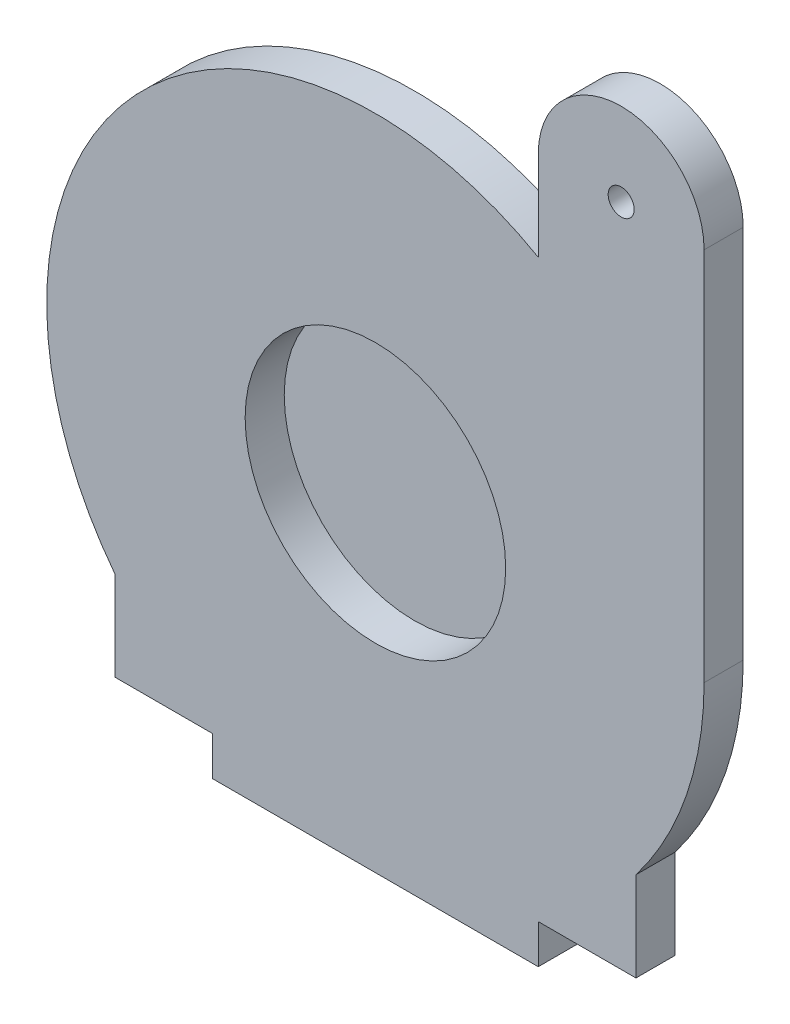
ISO-10303-21;
HEADER;
FILE_DESCRIPTION(('STEP AP214'),'2;1');
FILE_NAME('part.step','',(''),(''),'','','');
FILE_SCHEMA(('AUTOMOTIVE_DESIGN { 1 0 10303 214 1 1 1 1 }'));
ENDSEC;
DATA;
#1=APPLICATION_CONTEXT('core data for automotive mechanical design processes');
#2=APPLICATION_PROTOCOL_DEFINITION('international standard','automotive_design',2000,#1);
#3=PRODUCT_CONTEXT('',#1,'mechanical');
#4=PRODUCT('Part','Part','',(#3));
#5=PRODUCT_RELATED_PRODUCT_CATEGORY('part','',(#4));
#6=PRODUCT_DEFINITION_FORMATION('','',#4);
#7=PRODUCT_DEFINITION_CONTEXT('part definition',#1,'design');
#8=PRODUCT_DEFINITION('design','',#6,#7);
#9=PRODUCT_DEFINITION_SHAPE('','',#8);
#10=(LENGTH_UNIT() NAMED_UNIT(*) SI_UNIT(.MILLI.,.METRE.));
#11=(NAMED_UNIT(*) PLANE_ANGLE_UNIT() SI_UNIT($,.RADIAN.));
#12=(NAMED_UNIT(*) SI_UNIT($,.STERADIAN.) SOLID_ANGLE_UNIT());
#13=UNCERTAINTY_MEASURE_WITH_UNIT(LENGTH_MEASURE(1.E-05),#10,'distance_accuracy_value','');
#14=(GEOMETRIC_REPRESENTATION_CONTEXT(3) GLOBAL_UNCERTAINTY_ASSIGNED_CONTEXT((#13)) GLOBAL_UNIT_ASSIGNED_CONTEXT((#10,
#11,#12)) REPRESENTATION_CONTEXT('',''));
#15=CARTESIAN_POINT('',(0.,0.,0.));
#16=DIRECTION('',(0.,0.,1.));
#17=DIRECTION('',(1.,0.,0.));
#18=AXIS2_PLACEMENT_3D('',#15,#16,#17);
#19=CARTESIAN_POINT('',(0.,0.,3.));
#20=DIRECTION('',(0.,1.,0.));
#21=DIRECTION('',(0.,0.,1.));
#22=AXIS2_PLACEMENT_3D('',#19,#20,#21);
#23=PLANE('',#22);
#24=DIRECTION('',(1.,0.,0.));
#25=VECTOR('',#24,1.);
#26=CARTESIAN_POINT('',(0.,0.,0.));
#27=LINE('',#26,#25);
#28=CARTESIAN_POINT('',(0.,0.,0.));
#29=VERTEX_POINT('',#28);
#30=CARTESIAN_POINT('',(7.5,0.,0.));
#31=VERTEX_POINT('',#30);
#32=EDGE_CURVE('E166',#29,#31,#27,.T.);
#33=ORIENTED_EDGE('',*,*,#32,.T.);
#34=DIRECTION('',(0.,0.,-1.));
#35=VECTOR('',#34,1.);
#36=CARTESIAN_POINT('',(7.5,0.,3.));
#37=LINE('',#36,#35);
#38=CARTESIAN_POINT('',(7.5,0.,3.));
#39=VERTEX_POINT('',#38);
#40=EDGE_CURVE('E44',#39,#31,#37,.T.);
#41=ORIENTED_EDGE('',*,*,#40,.F.);
#42=DIRECTION('',(1.,0.,0.));
#43=VECTOR('',#42,1.);
#44=CARTESIAN_POINT('',(0.,0.,3.));
#45=LINE('',#44,#43);
#46=CARTESIAN_POINT('',(0.,0.,3.));
#47=VERTEX_POINT('',#46);
#48=EDGE_CURVE('E281',#47,#39,#45,.T.);
#49=ORIENTED_EDGE('',*,*,#48,.F.);
#50=DIRECTION('',(0.,0.,-1.));
#51=VECTOR('',#50,1.);
#52=CARTESIAN_POINT('',(0.,0.,3.));
#53=LINE('',#52,#51);
#54=EDGE_CURVE('E52',#47,#29,#53,.T.);
#55=ORIENTED_EDGE('',*,*,#54,.T.);
#56=EDGE_LOOP('',(#33,#41,#49,#55));
#57=FACE_BOUND('',#56,.T.);
#58=ADVANCED_FACE('F35',(#57),#23,.F.);
#59=CARTESIAN_POINT('',(7.5,0.,3.));
#60=DIRECTION('',(1.,0.,0.));
#61=DIRECTION('',(0.,0.,-1.));
#62=AXIS2_PLACEMENT_3D('',#59,#60,#61);
#63=PLANE('',#62);
#64=DIRECTION('',(0.,-1.,0.));
#65=VECTOR('',#64,1.);
#66=CARTESIAN_POINT('',(7.5,0.,0.));
#67=LINE('',#66,#65);
#68=CARTESIAN_POINT('',(7.5,-3.,0.));
#69=VERTEX_POINT('',#68);
#70=EDGE_CURVE('E168',#31,#69,#67,.T.);
#71=ORIENTED_EDGE('',*,*,#70,.T.);
#72=DIRECTION('',(0.,0.,-1.));
#73=VECTOR('',#72,1.);
#74=CARTESIAN_POINT('',(7.5,-3.,3.));
#75=LINE('',#74,#73);
#76=CARTESIAN_POINT('',(7.5,-3.,3.));
#77=VERTEX_POINT('',#76);
#78=EDGE_CURVE('E212',#77,#69,#75,.T.);
#79=ORIENTED_EDGE('',*,*,#78,.F.);
#80=DIRECTION('',(0.,-1.,0.));
#81=VECTOR('',#80,1.);
#82=CARTESIAN_POINT('',(7.5,0.,3.));
#83=LINE('',#82,#81);
#84=EDGE_CURVE('E104',#39,#77,#83,.T.);
#85=ORIENTED_EDGE('',*,*,#84,.F.);
#86=ORIENTED_EDGE('',*,*,#40,.T.);
#87=EDGE_LOOP('',(#71,#79,#85,#86));
#88=FACE_BOUND('',#87,.T.);
#89=ADVANCED_FACE('F215',(#88),#63,.F.);
#90=CARTESIAN_POINT('',(0.,-3.,3.));
#91=DIRECTION('',(0.,1.,0.));
#92=DIRECTION('',(0.,0.,1.));
#93=AXIS2_PLACEMENT_3D('',#90,#91,#92);
#94=PLANE('',#93);
#95=DIRECTION('',(1.,0.,0.));
#96=VECTOR('',#95,1.);
#97=CARTESIAN_POINT('',(0.,-3.,0.));
#98=LINE('',#97,#96);
#99=CARTESIAN_POINT('',(32.5,-3.,0.));
#100=VERTEX_POINT('',#99);
#101=EDGE_CURVE('E171',#69,#100,#98,.T.);
#102=ORIENTED_EDGE('',*,*,#101,.T.);
#103=DIRECTION('',(0.,0.,-1.));
#104=VECTOR('',#103,1.);
#105=CARTESIAN_POINT('',(32.5,-3.,3.));
#106=LINE('',#105,#104);
#107=CARTESIAN_POINT('',(32.5,-3.,3.));
#108=VERTEX_POINT('',#107);
#109=EDGE_CURVE('E209',#108,#100,#106,.T.);
#110=ORIENTED_EDGE('',*,*,#109,.F.);
#111=DIRECTION('',(1.,0.,0.));
#112=VECTOR('',#111,1.);
#113=CARTESIAN_POINT('',(0.,-3.,3.));
#114=LINE('',#113,#112);
#115=EDGE_CURVE('E278',#77,#108,#114,.T.);
#116=ORIENTED_EDGE('',*,*,#115,.F.);
#117=ORIENTED_EDGE('',*,*,#78,.T.);
#118=EDGE_LOOP('',(#102,#110,#116,#117));
#119=FACE_BOUND('',#118,.T.);
#120=ADVANCED_FACE('F238',(#119),#94,.F.);
#121=CARTESIAN_POINT('',(32.5,0.,3.));
#122=DIRECTION('',(-1.,0.,0.));
#123=DIRECTION('',(0.,0.,1.));
#124=AXIS2_PLACEMENT_3D('',#121,#122,#123);
#125=PLANE('',#124);
#126=DIRECTION('',(0.,1.,0.));
#127=VECTOR('',#126,1.);
#128=CARTESIAN_POINT('',(32.5,0.,0.));
#129=LINE('',#128,#127);
#130=CARTESIAN_POINT('',(32.5,0.,0.));
#131=VERTEX_POINT('',#130);
#132=EDGE_CURVE('E173',#100,#131,#129,.T.);
#133=ORIENTED_EDGE('',*,*,#132,.T.);
#134=DIRECTION('',(0.,0.,-1.));
#135=VECTOR('',#134,1.);
#136=CARTESIAN_POINT('',(32.5,0.,3.));
#137=LINE('',#136,#135);
#138=CARTESIAN_POINT('',(32.5,0.,3.));
#139=VERTEX_POINT('',#138);
#140=EDGE_CURVE('E206',#139,#131,#137,.T.);
#141=ORIENTED_EDGE('',*,*,#140,.F.);
#142=DIRECTION('',(0.,1.,0.));
#143=VECTOR('',#142,1.);
#144=CARTESIAN_POINT('',(32.5,0.,3.));
#145=LINE('',#144,#143);
#146=EDGE_CURVE('E276',#108,#139,#145,.T.);
#147=ORIENTED_EDGE('',*,*,#146,.F.);
#148=ORIENTED_EDGE('',*,*,#109,.T.);
#149=EDGE_LOOP('',(#133,#141,#147,#148));
#150=FACE_BOUND('',#149,.T.);
#151=ADVANCED_FACE('F244',(#150),#125,.F.);
#152=CARTESIAN_POINT('',(40.,0.,0.));
#153=VERTEX_POINT('',#152);
#154=EDGE_CURVE('E169',#131,#153,#27,.T.);
#155=ORIENTED_EDGE('',*,*,#154,.T.);
#156=DIRECTION('',(0.,0.,-1.));
#157=VECTOR('',#156,1.);
#158=CARTESIAN_POINT('',(40.,0.,3.));
#159=LINE('',#158,#157);
#160=CARTESIAN_POINT('',(40.,0.,3.));
#161=VERTEX_POINT('',#160);
#162=EDGE_CURVE('E203',#161,#153,#159,.T.);
#163=ORIENTED_EDGE('',*,*,#162,.F.);
#164=EDGE_CURVE('E275',#139,#161,#45,.T.);
#165=ORIENTED_EDGE('',*,*,#164,.F.);
#166=ORIENTED_EDGE('',*,*,#140,.T.);
#167=EDGE_LOOP('',(#155,#163,#165,#166));
#168=FACE_BOUND('',#167,.T.);
#169=ADVANCED_FACE('F234',(#168),#23,.F.);
#170=CARTESIAN_POINT('',(40.,0.,3.));
#171=DIRECTION('',(-1.,0.,0.));
#172=DIRECTION('',(0.,0.,1.));
#173=AXIS2_PLACEMENT_3D('',#170,#171,#172);
#174=PLANE('',#173);
#175=DIRECTION('',(0.,1.,0.));
#176=VECTOR('',#175,1.);
#177=CARTESIAN_POINT('',(40.,0.,0.));
#178=LINE('',#177,#176);
#179=CARTESIAN_POINT('',(40.,6.86708178730772,0.));
#180=VERTEX_POINT('',#179);
#181=EDGE_CURVE('E175',#153,#180,#178,.T.);
#182=ORIENTED_EDGE('',*,*,#181,.T.);
#183=DIRECTION('',(0.,0.,-1.));
#184=VECTOR('',#183,1.);
#185=CARTESIAN_POINT('',(40.,6.86708178730772,3.));
#186=LINE('',#185,#184);
#187=CARTESIAN_POINT('',(40.,6.86708178730772,3.));
#188=VERTEX_POINT('',#187);
#189=EDGE_CURVE('E200',#188,#180,#186,.T.);
#190=ORIENTED_EDGE('',*,*,#189,.F.);
#191=DIRECTION('',(0.,1.,0.));
#192=VECTOR('',#191,1.);
#193=CARTESIAN_POINT('',(40.,0.,3.));
#194=LINE('',#193,#192);
#195=EDGE_CURVE('E261',#161,#188,#194,.T.);
#196=ORIENTED_EDGE('',*,*,#195,.F.);
#197=ORIENTED_EDGE('',*,*,#162,.T.);
#198=EDGE_LOOP('',(#182,#190,#196,#197));
#199=FACE_BOUND('',#198,.T.);
#200=ADVANCED_FACE('F243',(#199),#174,.F.);
#201=CARTESIAN_POINT('',(20.,22.2498705071397,3.));
#202=DIRECTION('',(0.,0.,-1.));
#203=DIRECTION('',(-1.,0.,0.));
#204=AXIS2_PLACEMENT_3D('',#201,#202,#203);
#205=CYLINDRICAL_SURFACE('',#204,25.231531637992);
#206=CARTESIAN_POINT('',(20.,22.2498705071397,0.));
#207=DIRECTION('',(0.,0.,1.));
#208=DIRECTION('',(1.,0.,0.));
#209=AXIS2_PLACEMENT_3D('',#206,#207,#208);
#210=CIRCLE('',#209,25.231531637992);
#211=CARTESIAN_POINT('',(45.231531637992,22.2498705071397,0.));
#212=VERTEX_POINT('',#211);
#213=EDGE_CURVE('E177',#180,#212,#210,.T.);
#214=ORIENTED_EDGE('',*,*,#213,.T.);
#215=DIRECTION('',(0.,0.,-1.));
#216=VECTOR('',#215,1.);
#217=CARTESIAN_POINT('',(45.231531637992,22.2498705071397,3.));
#218=LINE('',#217,#216);
#219=CARTESIAN_POINT('',(45.231531637992,22.2498705071397,3.));
#220=VERTEX_POINT('',#219);
#221=EDGE_CURVE('E197',#220,#212,#218,.T.);
#222=ORIENTED_EDGE('',*,*,#221,.F.);
#223=CARTESIAN_POINT('',(20.,22.2498705071397,3.));
#224=DIRECTION('',(0.,0.,1.));
#225=DIRECTION('',(1.,0.,0.));
#226=AXIS2_PLACEMENT_3D('',#223,#224,#225);
#227=CIRCLE('',#226,25.231531637992);
#228=EDGE_CURVE('E271',#188,#220,#227,.T.);
#229=ORIENTED_EDGE('',*,*,#228,.F.);
#230=ORIENTED_EDGE('',*,*,#189,.T.);
#231=EDGE_LOOP('',(#214,#222,#229,#230));
#232=FACE_BOUND('',#231,.T.);
#233=ADVANCED_FACE('F250',(#232),#205,.T.);
#234=CARTESIAN_POINT('',(45.231531637992,0.,3.));
#235=DIRECTION('',(-1.,0.,0.));
#236=DIRECTION('',(0.,0.,1.));
#237=AXIS2_PLACEMENT_3D('',#234,#235,#236);
#238=PLANE('',#237);
#239=DIRECTION('',(0.,1.,0.));
#240=VECTOR('',#239,1.);
#241=CARTESIAN_POINT('',(45.231531637992,0.,0.));
#242=LINE('',#241,#240);
#243=CARTESIAN_POINT('',(45.231531637992,51.0238573480053,0.));
#244=VERTEX_POINT('',#243);
#245=EDGE_CURVE('E179',#212,#244,#242,.T.);
#246=ORIENTED_EDGE('',*,*,#245,.T.);
#247=DIRECTION('',(0.,0.,-1.));
#248=VECTOR('',#247,1.);
#249=CARTESIAN_POINT('',(45.231531637992,51.0238573480053,3.));
#250=LINE('',#249,#248);
#251=CARTESIAN_POINT('',(45.231531637992,51.0238573480053,3.));
#252=VERTEX_POINT('',#251);
#253=EDGE_CURVE('E195',#252,#244,#250,.T.);
#254=ORIENTED_EDGE('',*,*,#253,.F.);
#255=DIRECTION('',(0.,1.,0.));
#256=VECTOR('',#255,1.);
#257=CARTESIAN_POINT('',(45.231531637992,0.,3.));
#258=LINE('',#257,#256);
#259=EDGE_CURVE('E154',#220,#252,#258,.T.);
#260=ORIENTED_EDGE('',*,*,#259,.F.);
#261=ORIENTED_EDGE('',*,*,#221,.T.);
#262=EDGE_LOOP('',(#246,#254,#260,#261));
#263=FACE_BOUND('',#262,.T.);
#264=ADVANCED_FACE('F269',(#263),#238,.F.);
#265=CARTESIAN_POINT('',(38.865765818996,51.0238573480053,3.));
#266=DIRECTION('',(0.,0.,-1.));
#267=DIRECTION('',(-1.,0.,0.));
#268=AXIS2_PLACEMENT_3D('',#265,#266,#267);
#269=CYLINDRICAL_SURFACE('',#268,6.36576581899599);
#270=CARTESIAN_POINT('',(38.865765818996,51.0238573480053,0.));
#271=DIRECTION('',(0.,0.,1.));
#272=DIRECTION('',(1.,0.,0.));
#273=AXIS2_PLACEMENT_3D('',#270,#271,#272);
#274=CIRCLE('',#273,6.36576581899599);
#275=CARTESIAN_POINT('',(32.5,51.0238573480053,0.));
#276=VERTEX_POINT('',#275);
#277=EDGE_CURVE('E182',#276,#244,#274,.F.);
#278=ORIENTED_EDGE('',*,*,#277,.F.);
#279=DIRECTION('',(0.,0.,-1.));
#280=VECTOR('',#279,1.);
#281=CARTESIAN_POINT('',(32.5,51.0238573480053,3.));
#282=LINE('',#281,#280);
#283=CARTESIAN_POINT('',(32.5,51.0238573480053,3.));
#284=VERTEX_POINT('',#283);
#285=EDGE_CURVE('E141',#284,#276,#282,.T.);
#286=ORIENTED_EDGE('',*,*,#285,.F.);
#287=CARTESIAN_POINT('',(38.865765818996,51.0238573480053,3.));
#288=DIRECTION('',(0.,0.,1.));
#289=DIRECTION('',(1.,0.,0.));
#290=AXIS2_PLACEMENT_3D('',#287,#288,#289);
#291=CIRCLE('',#290,6.36576581899599);
#292=EDGE_CURVE('E152',#284,#252,#291,.F.);
#293=ORIENTED_EDGE('',*,*,#292,.T.);
#294=ORIENTED_EDGE('',*,*,#253,.T.);
#295=EDGE_LOOP('',(#278,#286,#293,#294));
#296=FACE_BOUND('',#295,.T.);
#297=ADVANCED_FACE('F352',(#296),#269,.T.);
#298=CARTESIAN_POINT('',(32.5,0.,3.));
#299=DIRECTION('',(-1.,0.,0.));
#300=DIRECTION('',(0.,0.,1.));
#301=AXIS2_PLACEMENT_3D('',#298,#299,#300);
#302=PLANE('',#301);
#303=DIRECTION('',(0.,1.,0.));
#304=VECTOR('',#303,1.);
#305=CARTESIAN_POINT('',(32.5,0.,0.));
#306=LINE('',#305,#304);
#307=CARTESIAN_POINT('',(32.5,44.1674476724878,0.));
#308=VERTEX_POINT('',#307);
#309=EDGE_CURVE('E138',#308,#276,#306,.T.);
#310=ORIENTED_EDGE('',*,*,#309,.F.);
#311=DIRECTION('',(0.,0.,-1.));
#312=VECTOR('',#311,1.);
#313=CARTESIAN_POINT('',(32.5,44.1674476724878,3.));
#314=LINE('',#313,#312);
#315=CARTESIAN_POINT('',(32.5,44.1674476724878,3.));
#316=VERTEX_POINT('',#315);
#317=EDGE_CURVE('E132',#316,#308,#314,.T.);
#318=ORIENTED_EDGE('',*,*,#317,.F.);
#319=DIRECTION('',(0.,1.,0.));
#320=VECTOR('',#319,1.);
#321=CARTESIAN_POINT('',(32.5,0.,3.));
#322=LINE('',#321,#320);
#323=EDGE_CURVE('E136',#316,#284,#322,.T.);
#324=ORIENTED_EDGE('',*,*,#323,.T.);
#325=ORIENTED_EDGE('',*,*,#285,.T.);
#326=EDGE_LOOP('',(#310,#318,#324,#325));
#327=FACE_BOUND('',#326,.T.);
#328=ADVANCED_FACE('F134',(#327),#302,.T.);
#329=CARTESIAN_POINT('',(20.,22.2498705071397,3.));
#330=DIRECTION('',(0.,0.,-1.));
#331=DIRECTION('',(-1.,0.,0.));
#332=AXIS2_PLACEMENT_3D('',#329,#330,#331);
#333=CYLINDRICAL_SURFACE('',#332,25.231531637992);
#334=CARTESIAN_POINT('',(20.,22.2498705071397,0.));
#335=DIRECTION('',(0.,0.,1.));
#336=DIRECTION('',(1.,0.,0.));
#337=AXIS2_PLACEMENT_3D('',#334,#335,#336);
#338=CIRCLE('',#337,25.231531637992);
#339=CARTESIAN_POINT('',(0.,6.86708178730772,0.));
#340=VERTEX_POINT('',#339);
#341=EDGE_CURVE('E186',#308,#340,#338,.T.);
#342=ORIENTED_EDGE('',*,*,#341,.T.);
#343=DIRECTION('',(0.,0.,-1.));
#344=VECTOR('',#343,1.);
#345=CARTESIAN_POINT('',(0.,6.86708178730772,3.));
#346=LINE('',#345,#344);
#347=CARTESIAN_POINT('',(0.,6.86708178730772,3.));
#348=VERTEX_POINT('',#347);
#349=EDGE_CURVE('E91',#348,#340,#346,.T.);
#350=ORIENTED_EDGE('',*,*,#349,.F.);
#351=CARTESIAN_POINT('',(20.,22.2498705071397,3.));
#352=DIRECTION('',(0.,0.,1.));
#353=DIRECTION('',(1.,0.,0.));
#354=AXIS2_PLACEMENT_3D('',#351,#352,#353);
#355=CIRCLE('',#354,25.231531637992);
#356=EDGE_CURVE('E143',#316,#348,#355,.T.);
#357=ORIENTED_EDGE('',*,*,#356,.F.);
#358=ORIENTED_EDGE('',*,*,#317,.T.);
#359=EDGE_LOOP('',(#342,#350,#357,#358));
#360=FACE_BOUND('',#359,.T.);
#361=ADVANCED_FACE('F144',(#360),#333,.T.);
#362=CARTESIAN_POINT('',(38.865765818996,51.0238573480053,3.));
#363=DIRECTION('',(0.,0.,-1.));
#364=DIRECTION('',(-1.,0.,0.));
#365=AXIS2_PLACEMENT_3D('',#362,#363,#364);
#366=CYLINDRICAL_SURFACE('',#365,0.999999999999998);
#367=CARTESIAN_POINT('',(38.865765818996,51.0238573480053,3.));
#368=DIRECTION('',(0.,0.,1.));
#369=DIRECTION('',(1.,0.,0.));
#370=AXIS2_PLACEMENT_3D('',#367,#368,#369);
#371=CIRCLE('',#370,0.999999999999998);
#372=CARTESIAN_POINT('',(39.865765818996,51.0238573480053,3.));
#373=VERTEX_POINT('',#372);
#374=EDGE_CURVE('E283',#373,#373,#371,.T.);
#375=ORIENTED_EDGE('',*,*,#374,.T.);
#376=EDGE_LOOP('',(#375));
#377=FACE_BOUND('',#376,.T.);
#378=CARTESIAN_POINT('',(38.865765818996,51.0238573480053,0.));
#379=DIRECTION('',(0.,0.,1.));
#380=DIRECTION('',(1.,0.,0.));
#381=AXIS2_PLACEMENT_3D('',#378,#379,#380);
#382=CIRCLE('',#381,0.999999999999998);
#383=CARTESIAN_POINT('',(39.865765818996,51.0238573480053,0.));
#384=VERTEX_POINT('',#383);
#385=EDGE_CURVE('E162',#384,#384,#382,.T.);
#386=ORIENTED_EDGE('',*,*,#385,.F.);
#387=EDGE_LOOP('',(#386));
#388=FACE_BOUND('',#387,.T.);
#389=ADVANCED_FACE('F228',(#377,#388),#366,.F.);
#390=CARTESIAN_POINT('',(20.,22.2498705071397,3.));
#391=DIRECTION('',(0.,0.,-1.));
#392=DIRECTION('',(-1.,0.,0.));
#393=AXIS2_PLACEMENT_3D('',#390,#391,#392);
#394=CYLINDRICAL_SURFACE('',#393,10.);
#395=CARTESIAN_POINT('',(20.,22.2498705071397,3.));
#396=DIRECTION('',(0.,0.,1.));
#397=DIRECTION('',(1.,0.,0.));
#398=AXIS2_PLACEMENT_3D('',#395,#396,#397);
#399=CIRCLE('',#398,10.);
#400=CARTESIAN_POINT('',(30.,22.2498705071397,3.));
#401=VERTEX_POINT('',#400);
#402=EDGE_CURVE('E191',#401,#401,#399,.T.);
#403=ORIENTED_EDGE('',*,*,#402,.T.);
#404=EDGE_LOOP('',(#403));
#405=FACE_BOUND('',#404,.T.);
#406=CARTESIAN_POINT('',(20.,22.2498705071397,0.));
#407=DIRECTION('',(0.,0.,1.));
#408=DIRECTION('',(1.,0.,0.));
#409=AXIS2_PLACEMENT_3D('',#406,#407,#408);
#410=CIRCLE('',#409,10.);
#411=CARTESIAN_POINT('',(30.,22.2498705071397,0.));
#412=VERTEX_POINT('',#411);
#413=EDGE_CURVE('E159',#412,#412,#410,.T.);
#414=ORIENTED_EDGE('',*,*,#413,.F.);
#415=EDGE_LOOP('',(#414));
#416=FACE_BOUND('',#415,.T.);
#417=ADVANCED_FACE('F37',(#405,#416),#394,.F.);
#418=CARTESIAN_POINT('',(0.,0.,3.));
#419=DIRECTION('',(-1.,0.,0.));
#420=DIRECTION('',(0.,0.,1.));
#421=AXIS2_PLACEMENT_3D('',#418,#419,#420);
#422=PLANE('',#421);
#423=DIRECTION('',(0.,1.,0.));
#424=VECTOR('',#423,1.);
#425=CARTESIAN_POINT('',(0.,0.,0.));
#426=LINE('',#425,#424);
#427=EDGE_CURVE('E188',#29,#340,#426,.T.);
#428=ORIENTED_EDGE('',*,*,#427,.F.);
#429=ORIENTED_EDGE('',*,*,#54,.F.);
#430=DIRECTION('',(0.,1.,0.));
#431=VECTOR('',#430,1.);
#432=CARTESIAN_POINT('',(0.,0.,3.));
#433=LINE('',#432,#431);
#434=EDGE_CURVE('E147',#47,#348,#433,.T.);
#435=ORIENTED_EDGE('',*,*,#434,.T.);
#436=ORIENTED_EDGE('',*,*,#349,.T.);
#437=EDGE_LOOP('',(#428,#429,#435,#436));
#438=FACE_BOUND('',#437,.T.);
#439=ADVANCED_FACE('F219',(#438),#422,.T.);
#440=CARTESIAN_POINT('',(0.,0.,3.));
#441=DIRECTION('',(0.,0.,1.));
#442=DIRECTION('',(1.,0.,0.));
#443=AXIS2_PLACEMENT_3D('',#440,#441,#442);
#444=PLANE('',#443);
#445=ORIENTED_EDGE('',*,*,#402,.F.);
#446=EDGE_LOOP('',(#445));
#447=FACE_BOUND('',#446,.T.);
#448=ORIENTED_EDGE('',*,*,#374,.F.);
#449=EDGE_LOOP('',(#448));
#450=FACE_BOUND('',#449,.T.);
#451=ORIENTED_EDGE('',*,*,#48,.T.);
#452=ORIENTED_EDGE('',*,*,#84,.T.);
#453=ORIENTED_EDGE('',*,*,#115,.T.);
#454=ORIENTED_EDGE('',*,*,#146,.T.);
#455=ORIENTED_EDGE('',*,*,#164,.T.);
#456=ORIENTED_EDGE('',*,*,#195,.T.);
#457=ORIENTED_EDGE('',*,*,#228,.T.);
#458=ORIENTED_EDGE('',*,*,#259,.T.);
#459=ORIENTED_EDGE('',*,*,#292,.F.);
#460=ORIENTED_EDGE('',*,*,#323,.F.);
#461=ORIENTED_EDGE('',*,*,#356,.T.);
#462=ORIENTED_EDGE('',*,*,#434,.F.);
#463=EDGE_LOOP('',(#451,#452,#453,#454,#455,#456,#457,#458,#459,#460,#461,#462));
#464=FACE_BOUND('',#463,.T.);
#465=ADVANCED_FACE('F150',(#447,#450,#464),#444,.T.);
#466=CARTESIAN_POINT('',(0.,0.,0.));
#467=DIRECTION('',(0.,0.,1.));
#468=DIRECTION('',(1.,0.,0.));
#469=AXIS2_PLACEMENT_3D('',#466,#467,#468);
#470=PLANE('',#469);
#471=CARTESIAN_POINT('',(20.,22.2498705071397,0.));
#472=DIRECTION('',(0.,0.,1.));
#473=DIRECTION('',(1.,0.,0.));
#474=AXIS2_PLACEMENT_3D('',#471,#472,#473);
#475=CIRCLE('',#474,17.5);
#476=CARTESIAN_POINT('',(37.5,22.2498705071397,0.));
#477=VERTEX_POINT('',#476);
#478=EDGE_CURVE('E11',#477,#477,#475,.F.);
#479=ORIENTED_EDGE('',*,*,#478,.F.);
#480=EDGE_LOOP('',(#479));
#481=FACE_BOUND('',#480,.T.);
#482=ORIENTED_EDGE('',*,*,#385,.T.);
#483=EDGE_LOOP('',(#482));
#484=FACE_BOUND('',#483,.T.);
#485=ORIENTED_EDGE('',*,*,#32,.F.);
#486=ORIENTED_EDGE('',*,*,#427,.T.);
#487=ORIENTED_EDGE('',*,*,#341,.F.);
#488=ORIENTED_EDGE('',*,*,#309,.T.);
#489=ORIENTED_EDGE('',*,*,#277,.T.);
#490=ORIENTED_EDGE('',*,*,#245,.F.);
#491=ORIENTED_EDGE('',*,*,#213,.F.);
#492=ORIENTED_EDGE('',*,*,#181,.F.);
#493=ORIENTED_EDGE('',*,*,#154,.F.);
#494=ORIENTED_EDGE('',*,*,#132,.F.);
#495=ORIENTED_EDGE('',*,*,#101,.F.);
#496=ORIENTED_EDGE('',*,*,#70,.F.);
#497=EDGE_LOOP('',(#485,#486,#487,#488,#489,#490,#491,#492,#493,#494,#495,#496));
#498=FACE_BOUND('',#497,.T.);
#499=ADVANCED_FACE('F217',(#481,#484,#498),#470,.F.);
#500=CARTESIAN_POINT('',(20.,22.2498705071397,-3.5));
#501=DIRECTION('',(0.,0.,-1.));
#502=DIRECTION('',(-1.,0.,0.));
#503=AXIS2_PLACEMENT_3D('',#500,#501,#502);
#504=PLANE('',#503);
#505=CARTESIAN_POINT('',(20.,22.2498705071397,-3.5));
#506=DIRECTION('',(0.,0.,-1.));
#507=DIRECTION('',(-1.,0.,0.));
#508=AXIS2_PLACEMENT_3D('',#505,#506,#507);
#509=CIRCLE('',#508,17.5);
#510=CARTESIAN_POINT('',(37.5,22.2498705071397,-3.5));
#511=VERTEX_POINT('',#510);
#512=EDGE_CURVE('E163',#511,#511,#509,.T.);
#513=ORIENTED_EDGE('',*,*,#512,.T.);
#514=EDGE_LOOP('',(#513));
#515=FACE_BOUND('',#514,.T.);
#516=ADVANCED_FACE('F291',(#515),#504,.T.);
#517=CARTESIAN_POINT('',(20.,22.2498705071397,-3.5));
#518=DIRECTION('',(0.,0.,1.));
#519=DIRECTION('',(1.,0.,0.));
#520=AXIS2_PLACEMENT_3D('',#517,#518,#519);
#521=CYLINDRICAL_SURFACE('',#520,17.5);
#522=CARTESIAN_POINT('',(37.5,22.2498705071397,-3.5));
#523=CARTESIAN_POINT('',(37.5,22.2498705071397,-3.46354166666667));
#524=CARTESIAN_POINT('',(37.5,22.2498705071397,-3.42708333333333));
#525=CARTESIAN_POINT('',(37.5,22.2498705071397,-3.35416666666667));
#526=CARTESIAN_POINT('',(37.5,22.2498705071397,-3.31770833333333));
#527=CARTESIAN_POINT('',(37.5,22.2498705071397,-3.24479166666667));
#528=CARTESIAN_POINT('',(37.5,22.2498705071397,-3.20833333333333));
#529=CARTESIAN_POINT('',(37.5,22.2498705071397,-3.13541666666667));
#530=CARTESIAN_POINT('',(37.5,22.2498705071397,-3.09895833333333));
#531=CARTESIAN_POINT('',(37.5,22.2498705071397,-3.02604166666667));
#532=CARTESIAN_POINT('',(37.5,22.2498705071397,-2.98958333333333));
#533=CARTESIAN_POINT('',(37.5,22.2498705071397,-2.91666666666667));
#534=CARTESIAN_POINT('',(37.5,22.2498705071397,-2.88020833333333));
#535=CARTESIAN_POINT('',(37.5,22.2498705071397,-2.80729166666667));
#536=CARTESIAN_POINT('',(37.5,22.2498705071397,-2.77083333333333));
#537=CARTESIAN_POINT('',(37.5,22.2498705071397,-2.69791666666667));
#538=CARTESIAN_POINT('',(37.5,22.2498705071397,-2.66145833333333));
#539=CARTESIAN_POINT('',(37.5,22.2498705071397,-2.58854166666667));
#540=CARTESIAN_POINT('',(37.5,22.2498705071397,-2.55208333333333));
#541=CARTESIAN_POINT('',(37.5,22.2498705071397,-2.47916666666667));
#542=CARTESIAN_POINT('',(37.5,22.2498705071397,-2.44270833333333));
#543=CARTESIAN_POINT('',(37.5,22.2498705071397,-2.36979166666667));
#544=CARTESIAN_POINT('',(37.5,22.2498705071397,-2.33333333333333));
#545=CARTESIAN_POINT('',(37.5,22.2498705071397,-2.26041666666667));
#546=CARTESIAN_POINT('',(37.5,22.2498705071397,-2.22395833333333));
#547=CARTESIAN_POINT('',(37.5,22.2498705071397,-2.15104166666667));
#548=CARTESIAN_POINT('',(37.5,22.2498705071397,-2.11458333333333));
#549=CARTESIAN_POINT('',(37.5,22.2498705071397,-2.04166666666667));
#550=CARTESIAN_POINT('',(37.5,22.2498705071397,-2.00520833333333));
#551=CARTESIAN_POINT('',(37.5,22.2498705071397,-1.93229166666667));
#552=CARTESIAN_POINT('',(37.5,22.2498705071397,-1.89583333333333));
#553=CARTESIAN_POINT('',(37.5,22.2498705071397,-1.82291666666667));
#554=CARTESIAN_POINT('',(37.5,22.2498705071397,-1.78645833333333));
#555=CARTESIAN_POINT('',(37.5,22.2498705071397,-1.71354166666667));
#556=CARTESIAN_POINT('',(37.5,22.2498705071397,-1.67708333333333));
#557=CARTESIAN_POINT('',(37.5,22.2498705071397,-1.60416666666667));
#558=CARTESIAN_POINT('',(37.5,22.2498705071397,-1.56770833333333));
#559=CARTESIAN_POINT('',(37.5,22.2498705071397,-1.49479166666667));
#560=CARTESIAN_POINT('',(37.5,22.2498705071397,-1.45833333333333));
#561=CARTESIAN_POINT('',(37.5,22.2498705071397,-1.38541666666667));
#562=CARTESIAN_POINT('',(37.5,22.2498705071397,-1.34895833333333));
#563=CARTESIAN_POINT('',(37.5,22.2498705071397,-1.27604166666667));
#564=CARTESIAN_POINT('',(37.5,22.2498705071397,-1.23958333333333));
#565=CARTESIAN_POINT('',(37.5,22.2498705071397,-1.16666666666667));
#566=CARTESIAN_POINT('',(37.5,22.2498705071397,-1.13020833333333));
#567=CARTESIAN_POINT('',(37.5,22.2498705071397,-1.05729166666667));
#568=CARTESIAN_POINT('',(37.5,22.2498705071397,-1.02083333333333));
#569=CARTESIAN_POINT('',(37.5,22.2498705071397,-0.947916666666667));
#570=CARTESIAN_POINT('',(37.5,22.2498705071397,-0.911458333333334));
#571=CARTESIAN_POINT('',(37.5,22.2498705071397,-0.838541666666667));
#572=CARTESIAN_POINT('',(37.5,22.2498705071397,-0.802083333333334));
#573=CARTESIAN_POINT('',(37.5,22.2498705071397,-0.729166666666667));
#574=CARTESIAN_POINT('',(37.5,22.2498705071397,-0.692708333333333));
#575=CARTESIAN_POINT('',(37.5,22.2498705071397,-0.619791666666667));
#576=CARTESIAN_POINT('',(37.5,22.2498705071397,-0.583333333333334));
#577=CARTESIAN_POINT('',(37.5,22.2498705071397,-0.510416666666667));
#578=CARTESIAN_POINT('',(37.5,22.2498705071397,-0.473958333333334));
#579=CARTESIAN_POINT('',(37.5,22.2498705071397,-0.401041666666667));
#580=CARTESIAN_POINT('',(37.5,22.2498705071397,-0.364583333333334));
#581=CARTESIAN_POINT('',(37.5,22.2498705071397,-0.291666666666667));
#582=CARTESIAN_POINT('',(37.5,22.2498705071397,-0.255208333333334));
#583=CARTESIAN_POINT('',(37.5,22.2498705071397,-0.182291666666667));
#584=CARTESIAN_POINT('',(37.5,22.2498705071397,-0.145833333333334));
#585=CARTESIAN_POINT('',(37.5,22.2498705071397,-0.0729166666666672));
#586=CARTESIAN_POINT('',(37.5,22.2498705071397,-0.0364583333333338));
#587=CARTESIAN_POINT('',(37.5,22.2498705071397,0.));
#588=B_SPLINE_CURVE_WITH_KNOTS('',3,(#522,#523,#524,#525,#526,#527,#528,#529,#530,#531,#532,
#533,#534,#535,#536,#537,#538,#539,#540,#541,#542,#543,#544,#545,#546,#547,#548,#549,#550,#551,
#552,#553,#554,#555,#556,#557,#558,#559,#560,#561,#562,#563,#564,#565,#566,#567,#568,#569,#570,
#571,#572,#573,#574,#575,#576,#577,#578,#579,#580,#581,#582,#583,#584,#585,#586,#587),
.UNSPECIFIED.,.F.,.F.,(4,2,2,2,2,2,2,2,2,2,2,2,2,2,2,2,2,2,2,2,2,2,2,2,2,2,2,2,2,2,2,2,4),(0.,
0.109375,0.21875,0.328125,0.4375,0.546875,0.656249999999999,0.765624999999999,0.874999999999999,
0.984375,1.09375,1.203125,1.3125,1.421875,1.53125,1.640625,1.75,1.859375,1.96875,2.078125,
2.1875,2.296875,2.40625,2.515625,2.625,2.734375,2.84375,2.953125,3.0625,3.171875,3.28125,
3.390625,3.5),.UNSPECIFIED.);
#589=EDGE_CURVE('BSEAM293',#511,#477,#588,.T.);
#590=ORIENTED_EDGE('',*,*,#512,.F.);
#591=ORIENTED_EDGE('',*,*,#478,.T.);
#592=ORIENTED_EDGE('',*,*,#589,.T.);
#593=ORIENTED_EDGE('',*,*,#589,.F.);
#594=EDGE_LOOP('',(#590,#592,#591,#593));
#595=FACE_BOUND('',#594,.T.);
#596=ADVANCED_FACE('F293',(#595),#521,.T.);
#597=CARTESIAN_POINT('',(20.,22.2498705071397,0.));
#598=DIRECTION('',(0.,0.,-1.));
#599=DIRECTION('',(-1.,0.,0.));
#600=AXIS2_PLACEMENT_3D('',#597,#598,#599);
#601=PLANE('',#600);
#602=ORIENTED_EDGE('',*,*,#413,.T.);
#603=EDGE_LOOP('',(#602));
#604=FACE_BOUND('',#603,.T.);
#605=ADVANCED_FACE('F296',(#604),#601,.F.);
#606=CLOSED_SHELL('',(#58,#89,#120,#151,#169,#200,#233,#264,#297,#328,#361,#389,#417,#439,#465,
#499,#516,#596,#605));
#607=MANIFOLD_SOLID_BREP('B2',#606);
#608=ADVANCED_BREP_SHAPE_REPRESENTATION('',(#18,#607),#14);
#609=SHAPE_DEFINITION_REPRESENTATION(#9,#608);
ENDSEC;
END-ISO-10303-21;
